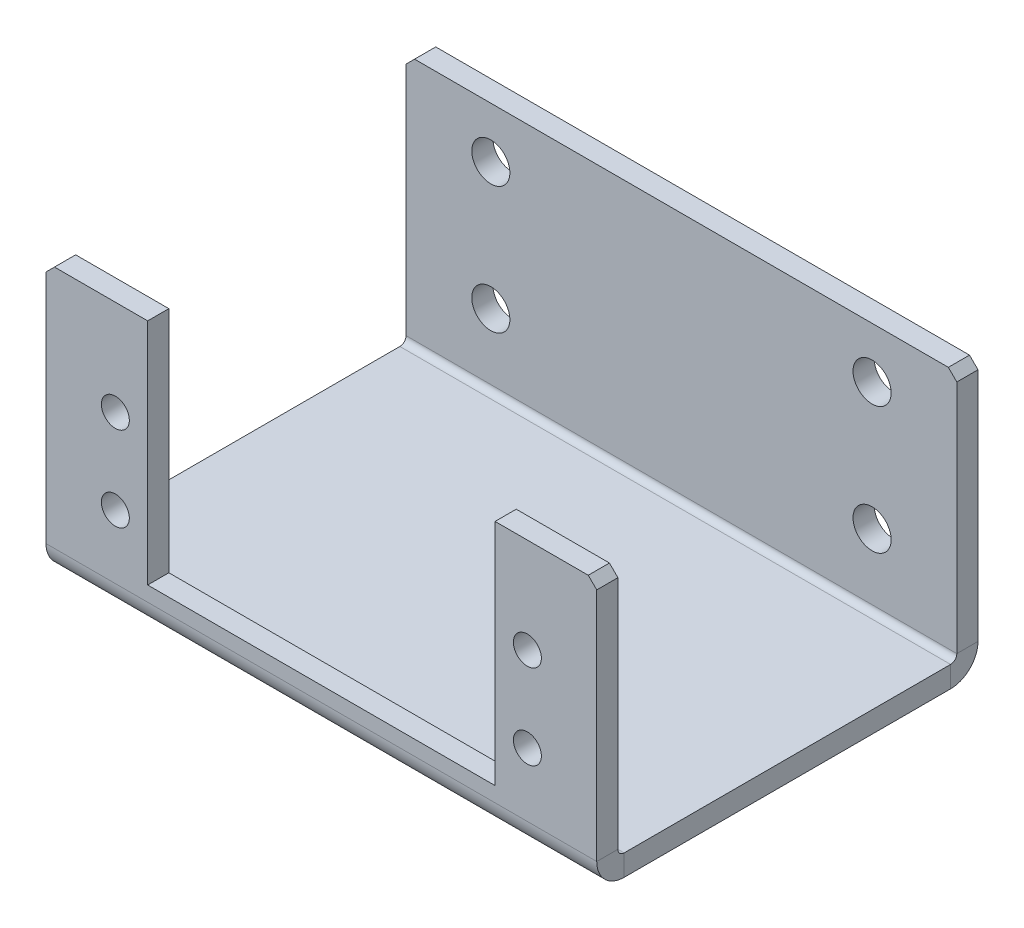
ISO-10303-21;
HEADER;
FILE_DESCRIPTION(('STEP AP214'),'2;1');
FILE_NAME('part.step','',(''),(''),'','','');
FILE_SCHEMA(('AUTOMOTIVE_DESIGN { 1 0 10303 214 1 1 1 1 }'));
ENDSEC;
DATA;
#1=APPLICATION_CONTEXT('core data for automotive mechanical design processes');
#2=APPLICATION_PROTOCOL_DEFINITION('international standard','automotive_design',2000,#1);
#3=PRODUCT_CONTEXT('',#1,'mechanical');
#4=PRODUCT('Part','Part','',(#3));
#5=PRODUCT_RELATED_PRODUCT_CATEGORY('part','',(#4));
#6=PRODUCT_DEFINITION_FORMATION('','',#4);
#7=PRODUCT_DEFINITION_CONTEXT('part definition',#1,'design');
#8=PRODUCT_DEFINITION('design','',#6,#7);
#9=PRODUCT_DEFINITION_SHAPE('','',#8);
#10=(LENGTH_UNIT() NAMED_UNIT(*) SI_UNIT(.MILLI.,.METRE.));
#11=(NAMED_UNIT(*) PLANE_ANGLE_UNIT() SI_UNIT($,.RADIAN.));
#12=(NAMED_UNIT(*) SI_UNIT($,.STERADIAN.) SOLID_ANGLE_UNIT());
#13=UNCERTAINTY_MEASURE_WITH_UNIT(LENGTH_MEASURE(1.E-05),#10,'distance_accuracy_value','');
#14=(GEOMETRIC_REPRESENTATION_CONTEXT(3) GLOBAL_UNCERTAINTY_ASSIGNED_CONTEXT((#13)) GLOBAL_UNIT_ASSIGNED_CONTEXT((#10,
#11,#12)) REPRESENTATION_CONTEXT('',''));
#15=CARTESIAN_POINT('',(0.,0.,0.));
#16=DIRECTION('',(0.,0.,1.));
#17=DIRECTION('',(1.,0.,0.));
#18=AXIS2_PLACEMENT_3D('',#15,#16,#17);
#19=CARTESIAN_POINT('',(-32.5,3.2366,20.));
#20=DIRECTION('',(-1.,0.,0.));
#21=DIRECTION('',(0.,0.,1.));
#22=AXIS2_PLACEMENT_3D('',#19,#20,#21);
#23=PLANE('',#22);
#24=DIRECTION('',(0.,0.,1.));
#25=VECTOR('',#24,1.);
#26=CARTESIAN_POINT('',(-32.5,0.,22.5));
#27=LINE('',#26,#25);
#28=CARTESIAN_POINT('',(-32.5,0.,-19.2634));
#29=VERTEX_POINT('',#28);
#30=CARTESIAN_POINT('',(-32.5,0.,19.2634));
#31=VERTEX_POINT('',#30);
#32=EDGE_CURVE('E247',#29,#31,#27,.T.);
#33=ORIENTED_EDGE('',*,*,#32,.T.);
#34=DIRECTION('',(0.,1.,0.));
#35=VECTOR('',#34,1.);
#36=CARTESIAN_POINT('',(-32.5,0.,19.2634));
#37=LINE('',#36,#35);
#38=CARTESIAN_POINT('',(-32.5,2.5,19.2634));
#39=VERTEX_POINT('',#38);
#40=EDGE_CURVE('E343',#31,#39,#37,.T.);
#41=ORIENTED_EDGE('',*,*,#40,.T.);
#42=DIRECTION('',(0.,0.,-1.));
#43=VECTOR('',#42,1.);
#44=CARTESIAN_POINT('',(-32.5,2.5,22.5));
#45=LINE('',#44,#43);
#46=CARTESIAN_POINT('',(-32.5,2.5,-19.2634));
#47=VERTEX_POINT('',#46);
#48=EDGE_CURVE('E328',#47,#39,#45,.F.);
#49=ORIENTED_EDGE('',*,*,#48,.F.);
#50=DIRECTION('',(0.,-1.,0.));
#51=VECTOR('',#50,1.);
#52=CARTESIAN_POINT('',(-32.5,2.5,-19.2634));
#53=LINE('',#52,#51);
#54=EDGE_CURVE('E207',#47,#29,#53,.T.);
#55=ORIENTED_EDGE('',*,*,#54,.T.);
#56=EDGE_LOOP('',(#33,#41,#49,#55));
#57=FACE_BOUND('',#56,.T.);
#58=ADVANCED_FACE('F39',(#57),#23,.T.);
#59=CARTESIAN_POINT('',(32.5,3.2366,-20.));
#60=DIRECTION('',(1.,0.,0.));
#61=DIRECTION('',(0.,0.,-1.));
#62=AXIS2_PLACEMENT_3D('',#59,#60,#61);
#63=PLANE('',#62);
#64=DIRECTION('',(0.,0.,1.));
#65=VECTOR('',#64,1.);
#66=CARTESIAN_POINT('',(32.5,0.,22.5));
#67=LINE('',#66,#65);
#68=CARTESIAN_POINT('',(32.5,0.,-19.2634));
#69=VERTEX_POINT('',#68);
#70=CARTESIAN_POINT('',(32.5,0.,19.2634));
#71=VERTEX_POINT('',#70);
#72=EDGE_CURVE('E324',#69,#71,#67,.T.);
#73=ORIENTED_EDGE('',*,*,#72,.F.);
#74=DIRECTION('',(0.,1.,0.));
#75=VECTOR('',#74,1.);
#76=CARTESIAN_POINT('',(32.5,0.,-19.2634));
#77=LINE('',#76,#75);
#78=CARTESIAN_POINT('',(32.5,2.5,-19.2634));
#79=VERTEX_POINT('',#78);
#80=EDGE_CURVE('E352',#69,#79,#77,.T.);
#81=ORIENTED_EDGE('',*,*,#80,.T.);
#82=DIRECTION('',(0.,0.,-1.));
#83=VECTOR('',#82,1.);
#84=CARTESIAN_POINT('',(32.5,2.5,22.5));
#85=LINE('',#84,#83);
#86=CARTESIAN_POINT('',(32.5,2.5,19.2634));
#87=VERTEX_POINT('',#86);
#88=EDGE_CURVE('E327',#79,#87,#85,.F.);
#89=ORIENTED_EDGE('',*,*,#88,.T.);
#90=DIRECTION('',(0.,-1.,0.));
#91=VECTOR('',#90,1.);
#92=CARTESIAN_POINT('',(32.5,2.5,19.2634));
#93=LINE('',#92,#91);
#94=EDGE_CURVE('E338',#87,#71,#93,.T.);
#95=ORIENTED_EDGE('',*,*,#94,.T.);
#96=EDGE_LOOP('',(#73,#81,#89,#95));
#97=FACE_BOUND('',#96,.T.);
#98=ADVANCED_FACE('F451',(#97),#63,.T.);
#99=CARTESIAN_POINT('',(32.5,0.,22.5));
#100=DIRECTION('',(0.,-1.,0.));
#101=DIRECTION('',(0.,0.,-1.));
#102=AXIS2_PLACEMENT_3D('',#99,#100,#101);
#103=PLANE('',#102);
#104=ORIENTED_EDGE('',*,*,#32,.F.);
#105=DIRECTION('',(-1.,0.,0.));
#106=VECTOR('',#105,1.);
#107=CARTESIAN_POINT('',(32.5,0.,-19.2634));
#108=LINE('',#107,#106);
#109=EDGE_CURVE('E346',#69,#29,#108,.T.);
#110=ORIENTED_EDGE('',*,*,#109,.F.);
#111=ORIENTED_EDGE('',*,*,#72,.T.);
#112=DIRECTION('',(-1.,0.,0.));
#113=VECTOR('',#112,1.);
#114=CARTESIAN_POINT('',(32.5,0.,19.2634));
#115=LINE('',#114,#113);
#116=EDGE_CURVE('E331',#71,#31,#115,.T.);
#117=ORIENTED_EDGE('',*,*,#116,.T.);
#118=EDGE_LOOP('',(#104,#110,#111,#117));
#119=FACE_BOUND('',#118,.T.);
#120=ADVANCED_FACE('F409',(#119),#103,.T.);
#121=CARTESIAN_POINT('',(32.5,2.5,22.5));
#122=DIRECTION('',(0.,-1.,0.));
#123=DIRECTION('',(0.,0.,-1.));
#124=AXIS2_PLACEMENT_3D('',#121,#122,#123);
#125=PLANE('',#124);
#126=ORIENTED_EDGE('',*,*,#48,.T.);
#127=DIRECTION('',(-1.,0.,0.));
#128=VECTOR('',#127,1.);
#129=CARTESIAN_POINT('',(32.5,2.5,19.2634));
#130=LINE('',#129,#128);
#131=EDGE_CURVE('E341',#87,#39,#130,.T.);
#132=ORIENTED_EDGE('',*,*,#131,.F.);
#133=ORIENTED_EDGE('',*,*,#88,.F.);
#134=DIRECTION('',(-1.,0.,0.));
#135=VECTOR('',#134,1.);
#136=CARTESIAN_POINT('',(32.5,2.5,-19.2634));
#137=LINE('',#136,#135);
#138=EDGE_CURVE('E349',#79,#47,#137,.T.);
#139=ORIENTED_EDGE('',*,*,#138,.T.);
#140=EDGE_LOOP('',(#126,#132,#133,#139));
#141=FACE_BOUND('',#140,.T.);
#142=ADVANCED_FACE('F403',(#141),#125,.F.);
#143=CARTESIAN_POINT('',(24.315,10.75,22.5));
#144=DIRECTION('',(0.,0.,1.));
#145=DIRECTION('',(1.,0.,0.));
#146=AXIS2_PLACEMENT_3D('',#143,#144,#145);
#147=CYLINDRICAL_SURFACE('',#146,1.64999999999999);
#148=CARTESIAN_POINT('',(24.315,10.75,22.5));
#149=DIRECTION('',(0.,0.,1.));
#150=DIRECTION('',(1.,0.,0.));
#151=AXIS2_PLACEMENT_3D('',#148,#149,#150);
#152=CIRCLE('',#151,1.64999999999999);
#153=CARTESIAN_POINT('',(25.965,10.75,22.5));
#154=VERTEX_POINT('',#153);
#155=EDGE_CURVE('E320',#154,#154,#152,.T.);
#156=ORIENTED_EDGE('',*,*,#155,.T.);
#157=EDGE_LOOP('',(#156));
#158=FACE_BOUND('',#157,.T.);
#159=CARTESIAN_POINT('',(24.315,10.75,20.));
#160=DIRECTION('',(0.,0.,1.));
#161=DIRECTION('',(1.,0.,0.));
#162=AXIS2_PLACEMENT_3D('',#159,#160,#161);
#163=CIRCLE('',#162,1.64999999999999);
#164=CARTESIAN_POINT('',(25.965,10.75,20.));
#165=VERTEX_POINT('',#164);
#166=EDGE_CURVE('E257',#165,#165,#163,.T.);
#167=ORIENTED_EDGE('',*,*,#166,.F.);
#168=EDGE_LOOP('',(#167));
#169=FACE_BOUND('',#168,.T.);
#170=ADVANCED_FACE('F757',(#158,#169),#147,.F.);
#171=CARTESIAN_POINT('',(24.315,20.75,22.5));
#172=DIRECTION('',(0.,0.,1.));
#173=DIRECTION('',(1.,0.,0.));
#174=AXIS2_PLACEMENT_3D('',#171,#172,#173);
#175=CYLINDRICAL_SURFACE('',#174,1.64999999999999);
#176=CARTESIAN_POINT('',(24.315,20.75,22.5));
#177=DIRECTION('',(0.,0.,1.));
#178=DIRECTION('',(1.,0.,0.));
#179=AXIS2_PLACEMENT_3D('',#176,#177,#178);
#180=CIRCLE('',#179,1.64999999999999);
#181=CARTESIAN_POINT('',(25.965,20.75,22.5));
#182=VERTEX_POINT('',#181);
#183=EDGE_CURVE('E317',#182,#182,#180,.T.);
#184=ORIENTED_EDGE('',*,*,#183,.T.);
#185=EDGE_LOOP('',(#184));
#186=FACE_BOUND('',#185,.T.);
#187=CARTESIAN_POINT('',(24.315,20.75,20.));
#188=DIRECTION('',(0.,0.,1.));
#189=DIRECTION('',(1.,0.,0.));
#190=AXIS2_PLACEMENT_3D('',#187,#188,#189);
#191=CIRCLE('',#190,1.64999999999999);
#192=CARTESIAN_POINT('',(25.965,20.75,20.));
#193=VERTEX_POINT('',#192);
#194=EDGE_CURVE('E260',#193,#193,#191,.T.);
#195=ORIENTED_EDGE('',*,*,#194,.F.);
#196=EDGE_LOOP('',(#195));
#197=FACE_BOUND('',#196,.T.);
#198=ADVANCED_FACE('F746',(#186,#197),#175,.F.);
#199=CARTESIAN_POINT('',(-24.315,10.75,22.5));
#200=DIRECTION('',(0.,0.,1.));
#201=DIRECTION('',(1.,0.,0.));
#202=AXIS2_PLACEMENT_3D('',#199,#200,#201);
#203=CYLINDRICAL_SURFACE('',#202,1.64999999999999);
#204=CARTESIAN_POINT('',(-24.315,10.75,22.5));
#205=DIRECTION('',(0.,0.,1.));
#206=DIRECTION('',(1.,0.,0.));
#207=AXIS2_PLACEMENT_3D('',#204,#205,#206);
#208=CIRCLE('',#207,1.64999999999999);
#209=CARTESIAN_POINT('',(-22.665,10.75,22.5));
#210=VERTEX_POINT('',#209);
#211=EDGE_CURVE('E314',#210,#210,#208,.T.);
#212=ORIENTED_EDGE('',*,*,#211,.T.);
#213=EDGE_LOOP('',(#212));
#214=FACE_BOUND('',#213,.T.);
#215=CARTESIAN_POINT('',(-24.315,10.75,20.));
#216=DIRECTION('',(0.,0.,1.));
#217=DIRECTION('',(1.,0.,0.));
#218=AXIS2_PLACEMENT_3D('',#215,#216,#217);
#219=CIRCLE('',#218,1.64999999999999);
#220=CARTESIAN_POINT('',(-22.665,10.75,20.));
#221=VERTEX_POINT('',#220);
#222=EDGE_CURVE('E263',#221,#221,#219,.T.);
#223=ORIENTED_EDGE('',*,*,#222,.F.);
#224=EDGE_LOOP('',(#223));
#225=FACE_BOUND('',#224,.T.);
#226=ADVANCED_FACE('F735',(#214,#225),#203,.F.);
#227=CARTESIAN_POINT('',(-24.315,20.75,22.5));
#228=DIRECTION('',(0.,0.,1.));
#229=DIRECTION('',(1.,0.,0.));
#230=AXIS2_PLACEMENT_3D('',#227,#228,#229);
#231=CYLINDRICAL_SURFACE('',#230,1.64999999999999);
#232=CARTESIAN_POINT('',(-24.315,20.75,22.5));
#233=DIRECTION('',(0.,0.,1.));
#234=DIRECTION('',(1.,0.,0.));
#235=AXIS2_PLACEMENT_3D('',#232,#233,#234);
#236=CIRCLE('',#235,1.64999999999999);
#237=CARTESIAN_POINT('',(-22.665,20.75,22.5));
#238=VERTEX_POINT('',#237);
#239=EDGE_CURVE('E309',#238,#238,#236,.T.);
#240=ORIENTED_EDGE('',*,*,#239,.T.);
#241=EDGE_LOOP('',(#240));
#242=FACE_BOUND('',#241,.T.);
#243=CARTESIAN_POINT('',(-24.315,20.75,20.));
#244=DIRECTION('',(0.,0.,1.));
#245=DIRECTION('',(1.,0.,0.));
#246=AXIS2_PLACEMENT_3D('',#243,#244,#245);
#247=CIRCLE('',#246,1.64999999999999);
#248=CARTESIAN_POINT('',(-22.665,20.75,20.));
#249=VERTEX_POINT('',#248);
#250=EDGE_CURVE('E266',#249,#249,#247,.T.);
#251=ORIENTED_EDGE('',*,*,#250,.F.);
#252=EDGE_LOOP('',(#251));
#253=FACE_BOUND('',#252,.T.);
#254=ADVANCED_FACE('F609',(#242,#253),#231,.F.);
#255=CARTESIAN_POINT('',(32.5,32.,22.5));
#256=DIRECTION('',(0.,1.,0.));
#257=DIRECTION('',(0.,0.,1.));
#258=AXIS2_PLACEMENT_3D('',#255,#256,#257);
#259=PLANE('',#258);
#260=DIRECTION('',(-1.,0.,0.));
#261=VECTOR('',#260,1.);
#262=CARTESIAN_POINT('',(32.5,32.,22.5));
#263=LINE('',#262,#261);
#264=CARTESIAN_POINT('',(31.5,32.,22.5));
#265=VERTEX_POINT('',#264);
#266=CARTESIAN_POINT('',(20.5,32.,22.5));
#267=VERTEX_POINT('',#266);
#268=EDGE_CURVE('E275',#265,#267,#263,.T.);
#269=ORIENTED_EDGE('',*,*,#268,.F.);
#270=DIRECTION('',(0.,0.,-1.));
#271=VECTOR('',#270,1.);
#272=CARTESIAN_POINT('',(31.5,32.,22.5));
#273=LINE('',#272,#271);
#274=CARTESIAN_POINT('',(31.5,32.,20.));
#275=VERTEX_POINT('',#274);
#276=EDGE_CURVE('E371',#265,#275,#273,.T.);
#277=ORIENTED_EDGE('',*,*,#276,.T.);
#278=DIRECTION('',(-1.,0.,0.));
#279=VECTOR('',#278,1.);
#280=CARTESIAN_POINT('',(32.5,32.,20.));
#281=LINE('',#280,#279);
#282=CARTESIAN_POINT('',(20.5,32.,20.));
#283=VERTEX_POINT('',#282);
#284=EDGE_CURVE('E306',#275,#283,#281,.T.);
#285=ORIENTED_EDGE('',*,*,#284,.T.);
#286=DIRECTION('',(0.,0.,-1.));
#287=VECTOR('',#286,1.);
#288=CARTESIAN_POINT('',(20.5,32.,22.5010000000002));
#289=LINE('',#288,#287);
#290=EDGE_CURVE('E292',#267,#283,#289,.T.);
#291=ORIENTED_EDGE('',*,*,#290,.F.);
#292=EDGE_LOOP('',(#269,#277,#285,#291));
#293=FACE_BOUND('',#292,.T.);
#294=ADVANCED_FACE('F429',(#293),#259,.T.);
#295=CARTESIAN_POINT('',(-20.5,32.,20.));
#296=VERTEX_POINT('',#295);
#297=CARTESIAN_POINT('',(-31.5,32.,20.));
#298=VERTEX_POINT('',#297);
#299=EDGE_CURVE('E305',#296,#298,#281,.T.);
#300=ORIENTED_EDGE('',*,*,#299,.T.);
#301=DIRECTION('',(0.,0.,1.));
#302=VECTOR('',#301,1.);
#303=CARTESIAN_POINT('',(-31.5,32.,22.5));
#304=LINE('',#303,#302);
#305=CARTESIAN_POINT('',(-31.5,32.,22.5));
#306=VERTEX_POINT('',#305);
#307=EDGE_CURVE('E11',#298,#306,#304,.T.);
#308=ORIENTED_EDGE('',*,*,#307,.T.);
#309=CARTESIAN_POINT('',(-20.5,32.,22.5));
#310=VERTEX_POINT('',#309);
#311=EDGE_CURVE('E278',#310,#306,#263,.T.);
#312=ORIENTED_EDGE('',*,*,#311,.F.);
#313=DIRECTION('',(0.,0.,-1.));
#314=VECTOR('',#313,1.);
#315=CARTESIAN_POINT('',(-20.5,32.,22.5010000000002));
#316=LINE('',#315,#314);
#317=EDGE_CURVE('E308',#310,#296,#316,.T.);
#318=ORIENTED_EDGE('',*,*,#317,.T.);
#319=EDGE_LOOP('',(#300,#308,#312,#318));
#320=FACE_BOUND('',#319,.T.);
#321=ADVANCED_FACE('F440',(#320),#259,.T.);
#322=CARTESIAN_POINT('',(-20.5,5.,22.5010000000002));
#323=DIRECTION('',(-1.,0.,0.));
#324=DIRECTION('',(0.,0.,1.));
#325=AXIS2_PLACEMENT_3D('',#322,#323,#324);
#326=PLANE('',#325);
#327=DIRECTION('',(0.,0.,-1.));
#328=VECTOR('',#327,1.);
#329=CARTESIAN_POINT('',(-20.5,5.,22.5010000000002));
#330=LINE('',#329,#328);
#331=CARTESIAN_POINT('',(-20.5,5.,22.5));
#332=VERTEX_POINT('',#331);
#333=CARTESIAN_POINT('',(-20.5,5.,20.));
#334=VERTEX_POINT('',#333);
#335=EDGE_CURVE('E303',#332,#334,#330,.T.);
#336=ORIENTED_EDGE('',*,*,#335,.T.);
#337=DIRECTION('',(0.,1.,0.));
#338=VECTOR('',#337,1.);
#339=CARTESIAN_POINT('',(-20.5,5.,20.));
#340=LINE('',#339,#338);
#341=EDGE_CURVE('E301',#334,#296,#340,.T.);
#342=ORIENTED_EDGE('',*,*,#341,.T.);
#343=ORIENTED_EDGE('',*,*,#317,.F.);
#344=DIRECTION('',(0.,1.,0.));
#345=VECTOR('',#344,1.);
#346=CARTESIAN_POINT('',(-20.5,5.,22.5));
#347=LINE('',#346,#345);
#348=EDGE_CURVE('E281',#332,#310,#347,.T.);
#349=ORIENTED_EDGE('',*,*,#348,.F.);
#350=EDGE_LOOP('',(#336,#342,#343,#349));
#351=FACE_BOUND('',#350,.T.);
#352=ADVANCED_FACE('F441',(#351),#326,.F.);
#353=CARTESIAN_POINT('',(-20.5,5.,22.5010000000002));
#354=DIRECTION('',(0.,-1.,0.));
#355=DIRECTION('',(1.,0.,0.));
#356=AXIS2_PLACEMENT_3D('',#353,#354,#355);
#357=PLANE('',#356);
#358=DIRECTION('',(0.,0.,-1.));
#359=VECTOR('',#358,1.);
#360=CARTESIAN_POINT('',(20.5,5.,22.5010000000002));
#361=LINE('',#360,#359);
#362=CARTESIAN_POINT('',(20.5,5.,22.5));
#363=VERTEX_POINT('',#362);
#364=CARTESIAN_POINT('',(20.5,5.,20.));
#365=VERTEX_POINT('',#364);
#366=EDGE_CURVE('E298',#363,#365,#361,.T.);
#367=ORIENTED_EDGE('',*,*,#366,.T.);
#368=DIRECTION('',(-1.,0.,0.));
#369=VECTOR('',#368,1.);
#370=CARTESIAN_POINT('',(-20.5,5.,20.));
#371=LINE('',#370,#369);
#372=EDGE_CURVE('E295',#365,#334,#371,.T.);
#373=ORIENTED_EDGE('',*,*,#372,.T.);
#374=ORIENTED_EDGE('',*,*,#335,.F.);
#375=DIRECTION('',(-1.,0.,0.));
#376=VECTOR('',#375,1.);
#377=CARTESIAN_POINT('',(-20.5,5.,22.5));
#378=LINE('',#377,#376);
#379=EDGE_CURVE('E284',#363,#332,#378,.T.);
#380=ORIENTED_EDGE('',*,*,#379,.F.);
#381=EDGE_LOOP('',(#367,#373,#374,#380));
#382=FACE_BOUND('',#381,.T.);
#383=ADVANCED_FACE('F438',(#382),#357,.F.);
#384=CARTESIAN_POINT('',(20.5,5.,22.5010000000002));
#385=DIRECTION('',(1.,0.,0.));
#386=DIRECTION('',(0.,0.,-1.));
#387=AXIS2_PLACEMENT_3D('',#384,#385,#386);
#388=PLANE('',#387);
#389=ORIENTED_EDGE('',*,*,#290,.T.);
#390=DIRECTION('',(0.,-1.,0.));
#391=VECTOR('',#390,1.);
#392=CARTESIAN_POINT('',(20.5,5.,20.));
#393=LINE('',#392,#391);
#394=EDGE_CURVE('E290',#283,#365,#393,.T.);
#395=ORIENTED_EDGE('',*,*,#394,.T.);
#396=ORIENTED_EDGE('',*,*,#366,.F.);
#397=DIRECTION('',(0.,-1.,0.));
#398=VECTOR('',#397,1.);
#399=CARTESIAN_POINT('',(20.5,5.,22.5));
#400=LINE('',#399,#398);
#401=EDGE_CURVE('E287',#267,#363,#400,.T.);
#402=ORIENTED_EDGE('',*,*,#401,.F.);
#403=EDGE_LOOP('',(#389,#395,#396,#402));
#404=FACE_BOUND('',#403,.T.);
#405=ADVANCED_FACE('F432',(#404),#388,.F.);
#406=CARTESIAN_POINT('',(32.5,0.,22.5));
#407=DIRECTION('',(0.,0.,1.));
#408=DIRECTION('',(1.,0.,0.));
#409=AXIS2_PLACEMENT_3D('',#406,#407,#408);
#410=PLANE('',#409);
#411=DIRECTION('',(0.,1.,0.));
#412=VECTOR('',#411,1.);
#413=CARTESIAN_POINT('',(32.5,0.,22.5));
#414=LINE('',#413,#412);
#415=CARTESIAN_POINT('',(32.5,3.2366,22.5));
#416=VERTEX_POINT('',#415);
#417=CARTESIAN_POINT('',(32.5,31.,22.5));
#418=VERTEX_POINT('',#417);
#419=EDGE_CURVE('E277',#416,#418,#414,.T.);
#420=ORIENTED_EDGE('',*,*,#419,.T.);
#421=DIRECTION('',(0.707106781186545,-0.70710678118655,0.));
#422=VECTOR('',#421,1.);
#423=CARTESIAN_POINT('',(48.,15.4999999999999,22.5));
#424=LINE('',#423,#422);
#425=EDGE_CURVE('E381',#418,#265,#424,.F.);
#426=ORIENTED_EDGE('',*,*,#425,.T.);
#427=ORIENTED_EDGE('',*,*,#268,.T.);
#428=ORIENTED_EDGE('',*,*,#401,.T.);
#429=ORIENTED_EDGE('',*,*,#379,.T.);
#430=ORIENTED_EDGE('',*,*,#348,.T.);
#431=ORIENTED_EDGE('',*,*,#311,.T.);
#432=DIRECTION('',(0.707106781186548,0.707106781186548,0.));
#433=VECTOR('',#432,1.);
#434=CARTESIAN_POINT('',(-15.5,48.,22.5));
#435=LINE('',#434,#433);
#436=CARTESIAN_POINT('',(-32.5,31.,22.5));
#437=VERTEX_POINT('',#436);
#438=EDGE_CURVE('E54',#306,#437,#435,.F.);
#439=ORIENTED_EDGE('',*,*,#438,.T.);
#440=DIRECTION('',(0.,1.,0.));
#441=VECTOR('',#440,1.);
#442=CARTESIAN_POINT('',(-32.5,0.,22.5));
#443=LINE('',#442,#441);
#444=CARTESIAN_POINT('',(-32.5,3.2366,22.5));
#445=VERTEX_POINT('',#444);
#446=EDGE_CURVE('E245',#445,#437,#443,.T.);
#447=ORIENTED_EDGE('',*,*,#446,.F.);
#448=DIRECTION('',(-1.,0.,0.));
#449=VECTOR('',#448,1.);
#450=CARTESIAN_POINT('',(32.5,3.2366,22.5));
#451=LINE('',#450,#449);
#452=EDGE_CURVE('E241',#416,#445,#451,.T.);
#453=ORIENTED_EDGE('',*,*,#452,.F.);
#454=EDGE_LOOP('',(#420,#426,#427,#428,#429,#430,#431,#439,#447,#453));
#455=FACE_BOUND('',#454,.T.);
#456=ORIENTED_EDGE('',*,*,#239,.F.);
#457=EDGE_LOOP('',(#456));
#458=FACE_BOUND('',#457,.T.);
#459=ORIENTED_EDGE('',*,*,#211,.F.);
#460=EDGE_LOOP('',(#459));
#461=FACE_BOUND('',#460,.T.);
#462=ORIENTED_EDGE('',*,*,#183,.F.);
#463=EDGE_LOOP('',(#462));
#464=FACE_BOUND('',#463,.T.);
#465=ORIENTED_EDGE('',*,*,#155,.F.);
#466=EDGE_LOOP('',(#465));
#467=FACE_BOUND('',#466,.T.);
#468=ADVANCED_FACE('F415',(#455,#458,#461,#464,#467),#410,.T.);
#469=CARTESIAN_POINT('',(32.5,2.5,19.2634));
#470=DIRECTION('',(1.,0.,0.));
#471=DIRECTION('',(0.,0.,-1.));
#472=AXIS2_PLACEMENT_3D('',#469,#470,#471);
#473=PLANE('',#472);
#474=DIRECTION('',(0.,1.,0.));
#475=VECTOR('',#474,1.);
#476=CARTESIAN_POINT('',(32.5,0.,20.));
#477=LINE('',#476,#475);
#478=CARTESIAN_POINT('',(32.5,3.2366,20.));
#479=VERTEX_POINT('',#478);
#480=CARTESIAN_POINT('',(32.5,31.,20.));
#481=VERTEX_POINT('',#480);
#482=EDGE_CURVE('E269',#479,#481,#477,.T.);
#483=ORIENTED_EDGE('',*,*,#482,.T.);
#484=DIRECTION('',(0.,0.,1.));
#485=VECTOR('',#484,1.);
#486=CARTESIAN_POINT('',(32.5,31.,19.2634));
#487=LINE('',#486,#485);
#488=EDGE_CURVE('E378',#481,#418,#487,.T.);
#489=ORIENTED_EDGE('',*,*,#488,.T.);
#490=ORIENTED_EDGE('',*,*,#419,.F.);
#491=DIRECTION('',(0.,0.,-1.));
#492=VECTOR('',#491,1.);
#493=CARTESIAN_POINT('',(32.5,3.2366,22.5));
#494=LINE('',#493,#492);
#495=EDGE_CURVE('E272',#416,#479,#494,.T.);
#496=ORIENTED_EDGE('',*,*,#495,.T.);
#497=EDGE_LOOP('',(#483,#489,#490,#496));
#498=FACE_BOUND('',#497,.T.);
#499=ADVANCED_FACE('F420',(#498),#473,.T.);
#500=CARTESIAN_POINT('',(32.5,0.,20.));
#501=DIRECTION('',(0.,0.,1.));
#502=DIRECTION('',(1.,0.,0.));
#503=AXIS2_PLACEMENT_3D('',#500,#501,#502);
#504=PLANE('',#503);
#505=ORIENTED_EDGE('',*,*,#250,.T.);
#506=EDGE_LOOP('',(#505));
#507=FACE_BOUND('',#506,.T.);
#508=ORIENTED_EDGE('',*,*,#222,.T.);
#509=EDGE_LOOP('',(#508));
#510=FACE_BOUND('',#509,.T.);
#511=ORIENTED_EDGE('',*,*,#194,.T.);
#512=EDGE_LOOP('',(#511));
#513=FACE_BOUND('',#512,.T.);
#514=ORIENTED_EDGE('',*,*,#166,.T.);
#515=EDGE_LOOP('',(#514));
#516=FACE_BOUND('',#515,.T.);
#517=ORIENTED_EDGE('',*,*,#284,.F.);
#518=DIRECTION('',(-0.707106781186545,0.70710678118655,0.));
#519=VECTOR('',#518,1.);
#520=CARTESIAN_POINT('',(31.5,32.,20.));
#521=LINE('',#520,#519);
#522=EDGE_CURVE('E376',#275,#481,#521,.F.);
#523=ORIENTED_EDGE('',*,*,#522,.T.);
#524=ORIENTED_EDGE('',*,*,#482,.F.);
#525=DIRECTION('',(-1.,0.,0.));
#526=VECTOR('',#525,1.);
#527=CARTESIAN_POINT('',(32.5,3.2366,20.));
#528=LINE('',#527,#526);
#529=CARTESIAN_POINT('',(-32.5,3.2366,20.));
#530=VERTEX_POINT('',#529);
#531=EDGE_CURVE('E254',#479,#530,#528,.T.);
#532=ORIENTED_EDGE('',*,*,#531,.T.);
#533=DIRECTION('',(0.,1.,0.));
#534=VECTOR('',#533,1.);
#535=CARTESIAN_POINT('',(-32.5,0.,20.));
#536=LINE('',#535,#534);
#537=CARTESIAN_POINT('',(-32.5,31.,20.));
#538=VERTEX_POINT('',#537);
#539=EDGE_CURVE('E251',#530,#538,#536,.T.);
#540=ORIENTED_EDGE('',*,*,#539,.T.);
#541=DIRECTION('',(-0.707106781186548,-0.707106781186548,0.));
#542=VECTOR('',#541,1.);
#543=CARTESIAN_POINT('',(-32.5,31.,20.));
#544=LINE('',#543,#542);
#545=EDGE_CURVE('E374',#538,#298,#544,.F.);
#546=ORIENTED_EDGE('',*,*,#545,.T.);
#547=ORIENTED_EDGE('',*,*,#299,.F.);
#548=ORIENTED_EDGE('',*,*,#341,.F.);
#549=ORIENTED_EDGE('',*,*,#372,.F.);
#550=ORIENTED_EDGE('',*,*,#394,.F.);
#551=EDGE_LOOP('',(#517,#523,#524,#532,#540,#546,#547,#548,#549,#550));
#552=FACE_BOUND('',#551,.T.);
#553=ADVANCED_FACE('F390',(#507,#510,#513,#516,#552),#504,.F.);
#554=CARTESIAN_POINT('',(-32.5,3.2366,19.2634));
#555=DIRECTION('',(-1.,0.,0.));
#556=DIRECTION('',(0.,0.,1.));
#557=AXIS2_PLACEMENT_3D('',#554,#555,#556);
#558=PLANE('',#557);
#559=ORIENTED_EDGE('',*,*,#446,.T.);
#560=DIRECTION('',(0.,0.,-1.));
#561=VECTOR('',#560,1.);
#562=CARTESIAN_POINT('',(-32.5,31.,19.2634));
#563=LINE('',#562,#561);
#564=EDGE_CURVE('E47',#437,#538,#563,.T.);
#565=ORIENTED_EDGE('',*,*,#564,.T.);
#566=ORIENTED_EDGE('',*,*,#539,.F.);
#567=DIRECTION('',(0.,0.,1.));
#568=VECTOR('',#567,1.);
#569=CARTESIAN_POINT('',(-32.5,3.2366,20.));
#570=LINE('',#569,#568);
#571=EDGE_CURVE('E248',#530,#445,#570,.T.);
#572=ORIENTED_EDGE('',*,*,#571,.T.);
#573=EDGE_LOOP('',(#559,#565,#566,#572));
#574=FACE_BOUND('',#573,.T.);
#575=ADVANCED_FACE('F386',(#574),#558,.T.);
#576=CARTESIAN_POINT('',(32.5,3.2366,19.2634));
#577=DIRECTION('',(1.,0.,0.));
#578=DIRECTION('',(0.,0.,-1.));
#579=AXIS2_PLACEMENT_3D('',#576,#577,#578);
#580=PLANE('',#579);
#581=ORIENTED_EDGE('',*,*,#94,.F.);
#582=CARTESIAN_POINT('',(32.5,3.2366,19.2634));
#583=DIRECTION('',(1.,0.,0.));
#584=DIRECTION('',(0.,0.,-1.));
#585=AXIS2_PLACEMENT_3D('',#582,#583,#584);
#586=CIRCLE('',#585,0.7366);
#587=EDGE_CURVE('E230',#87,#479,#586,.F.);
#588=ORIENTED_EDGE('',*,*,#587,.T.);
#589=ORIENTED_EDGE('',*,*,#495,.F.);
#590=CARTESIAN_POINT('',(32.5,3.2366,19.2634));
#591=DIRECTION('',(-1.,0.,0.));
#592=DIRECTION('',(0.,0.,1.));
#593=AXIS2_PLACEMENT_3D('',#590,#591,#592);
#594=CIRCLE('',#593,3.2366);
#595=EDGE_CURVE('E234',#71,#416,#594,.T.);
#596=ORIENTED_EDGE('',*,*,#595,.F.);
#597=EDGE_LOOP('',(#581,#588,#589,#596));
#598=FACE_BOUND('',#597,.T.);
#599=ADVANCED_FACE('F558',(#598),#580,.T.);
#600=CARTESIAN_POINT('',(-32.5,3.2366,19.2634));
#601=DIRECTION('',(-1.,0.,0.));
#602=DIRECTION('',(0.,0.,1.));
#603=AXIS2_PLACEMENT_3D('',#600,#601,#602);
#604=PLANE('',#603);
#605=ORIENTED_EDGE('',*,*,#571,.F.);
#606=CARTESIAN_POINT('',(-32.5,3.2366,19.2634));
#607=DIRECTION('',(1.,0.,0.));
#608=DIRECTION('',(0.,0.,-1.));
#609=AXIS2_PLACEMENT_3D('',#606,#607,#608);
#610=CIRCLE('',#609,0.7366);
#611=EDGE_CURVE('E238',#530,#39,#610,.T.);
#612=ORIENTED_EDGE('',*,*,#611,.T.);
#613=ORIENTED_EDGE('',*,*,#40,.F.);
#614=CARTESIAN_POINT('',(-32.5,3.2366,19.2634));
#615=DIRECTION('',(1.,0.,0.));
#616=DIRECTION('',(0.,0.,-1.));
#617=AXIS2_PLACEMENT_3D('',#614,#615,#616);
#618=CIRCLE('',#617,3.2366);
#619=EDGE_CURVE('E237',#445,#31,#618,.T.);
#620=ORIENTED_EDGE('',*,*,#619,.F.);
#621=EDGE_LOOP('',(#605,#612,#613,#620));
#622=FACE_BOUND('',#621,.T.);
#623=ADVANCED_FACE('F400',(#622),#604,.T.);
#624=CARTESIAN_POINT('',(-65.1228669113135,3.2366,19.2634));
#625=DIRECTION('',(1.,0.,0.));
#626=DIRECTION('',(0.,0.,-1.));
#627=AXIS2_PLACEMENT_3D('',#624,#625,#626);
#628=CYLINDRICAL_SURFACE('',#627,3.2366);
#629=ORIENTED_EDGE('',*,*,#619,.T.);
#630=ORIENTED_EDGE('',*,*,#116,.F.);
#631=ORIENTED_EDGE('',*,*,#595,.T.);
#632=ORIENTED_EDGE('',*,*,#452,.T.);
#633=EDGE_LOOP('',(#629,#630,#631,#632));
#634=FACE_BOUND('',#633,.T.);
#635=ADVANCED_FACE('F413',(#634),#628,.T.);
#636=CARTESIAN_POINT('',(-65.1228669113135,3.2366,19.2634));
#637=DIRECTION('',(1.,0.,0.));
#638=DIRECTION('',(0.,0.,-1.));
#639=AXIS2_PLACEMENT_3D('',#636,#637,#638);
#640=CYLINDRICAL_SURFACE('',#639,0.7366);
#641=ORIENTED_EDGE('',*,*,#611,.F.);
#642=ORIENTED_EDGE('',*,*,#531,.F.);
#643=ORIENTED_EDGE('',*,*,#587,.F.);
#644=ORIENTED_EDGE('',*,*,#131,.T.);
#645=EDGE_LOOP('',(#641,#642,#643,#644));
#646=FACE_BOUND('',#645,.T.);
#647=ADVANCED_FACE('F397',(#646),#640,.F.);
#648=CARTESIAN_POINT('',(32.5,3.2366,-19.2634));
#649=DIRECTION('',(1.,0.,0.));
#650=DIRECTION('',(0.,0.,-1.));
#651=AXIS2_PLACEMENT_3D('',#648,#649,#650);
#652=PLANE('',#651);
#653=DIRECTION('',(0.,0.,-1.));
#654=VECTOR('',#653,1.);
#655=CARTESIAN_POINT('',(32.5,3.23660000000003,-20.));
#656=LINE('',#655,#654);
#657=CARTESIAN_POINT('',(32.5,3.23660000000003,-20.));
#658=VERTEX_POINT('',#657);
#659=CARTESIAN_POINT('',(32.5,3.23660000000003,-22.5));
#660=VERTEX_POINT('',#659);
#661=EDGE_CURVE('E233',#658,#660,#656,.T.);
#662=ORIENTED_EDGE('',*,*,#661,.F.);
#663=CARTESIAN_POINT('',(32.5,3.2366,-19.2634));
#664=DIRECTION('',(1.,0.,0.));
#665=DIRECTION('',(0.,0.,-1.));
#666=AXIS2_PLACEMENT_3D('',#663,#664,#665);
#667=CIRCLE('',#666,0.7366);
#668=EDGE_CURVE('E212',#658,#79,#667,.F.);
#669=ORIENTED_EDGE('',*,*,#668,.T.);
#670=ORIENTED_EDGE('',*,*,#80,.F.);
#671=CARTESIAN_POINT('',(32.5,3.2366,-19.2634));
#672=DIRECTION('',(-1.,0.,0.));
#673=DIRECTION('',(0.,0.,1.));
#674=AXIS2_PLACEMENT_3D('',#671,#672,#673);
#675=CIRCLE('',#674,3.2366);
#676=EDGE_CURVE('E211',#660,#69,#675,.T.);
#677=ORIENTED_EDGE('',*,*,#676,.F.);
#678=EDGE_LOOP('',(#662,#669,#670,#677));
#679=FACE_BOUND('',#678,.T.);
#680=ADVANCED_FACE('F668',(#679),#652,.T.);
#681=CARTESIAN_POINT('',(-32.5,3.2366,-19.2634));
#682=DIRECTION('',(-1.,0.,0.));
#683=DIRECTION('',(0.,0.,1.));
#684=AXIS2_PLACEMENT_3D('',#681,#682,#683);
#685=PLANE('',#684);
#686=ORIENTED_EDGE('',*,*,#54,.F.);
#687=CARTESIAN_POINT('',(-32.5,3.2366,-19.2634));
#688=DIRECTION('',(1.,0.,0.));
#689=DIRECTION('',(0.,0.,-1.));
#690=AXIS2_PLACEMENT_3D('',#687,#688,#689);
#691=CIRCLE('',#690,0.7366);
#692=CARTESIAN_POINT('',(-32.5,3.23660000000003,-20.));
#693=VERTEX_POINT('',#692);
#694=EDGE_CURVE('E204',#47,#693,#691,.T.);
#695=ORIENTED_EDGE('',*,*,#694,.T.);
#696=DIRECTION('',(0.,0.,1.));
#697=VECTOR('',#696,1.);
#698=CARTESIAN_POINT('',(-32.5,3.23660000000004,-22.5));
#699=LINE('',#698,#697);
#700=CARTESIAN_POINT('',(-32.5,3.23660000000004,-22.5));
#701=VERTEX_POINT('',#700);
#702=EDGE_CURVE('E191',#701,#693,#699,.T.);
#703=ORIENTED_EDGE('',*,*,#702,.F.);
#704=CARTESIAN_POINT('',(-32.5,3.2366,-19.2634));
#705=DIRECTION('',(1.,0.,0.));
#706=DIRECTION('',(0.,0.,-1.));
#707=AXIS2_PLACEMENT_3D('',#704,#705,#706);
#708=CIRCLE('',#707,3.2366);
#709=EDGE_CURVE('E229',#29,#701,#708,.T.);
#710=ORIENTED_EDGE('',*,*,#709,.F.);
#711=EDGE_LOOP('',(#686,#695,#703,#710));
#712=FACE_BOUND('',#711,.T.);
#713=ADVANCED_FACE('F205',(#712),#685,.T.);
#714=CARTESIAN_POINT('',(-65.1228669113136,3.2366,-19.2634));
#715=DIRECTION('',(1.,0.,0.));
#716=DIRECTION('',(0.,0.,-1.));
#717=AXIS2_PLACEMENT_3D('',#714,#715,#716);
#718=CYLINDRICAL_SURFACE('',#717,3.2366);
#719=ORIENTED_EDGE('',*,*,#709,.T.);
#720=DIRECTION('',(-1.,0.,0.));
#721=VECTOR('',#720,1.);
#722=CARTESIAN_POINT('',(32.5,3.23660000000004,-22.5));
#723=LINE('',#722,#721);
#724=EDGE_CURVE('E866',#660,#701,#723,.T.);
#725=ORIENTED_EDGE('',*,*,#724,.F.);
#726=ORIENTED_EDGE('',*,*,#676,.T.);
#727=ORIENTED_EDGE('',*,*,#109,.T.);
#728=EDGE_LOOP('',(#719,#725,#726,#727));
#729=FACE_BOUND('',#728,.T.);
#730=ADVANCED_FACE('F651',(#729),#718,.T.);
#731=CARTESIAN_POINT('',(-65.1228669113136,3.2366,-19.2634));
#732=DIRECTION('',(1.,0.,0.));
#733=DIRECTION('',(0.,0.,-1.));
#734=AXIS2_PLACEMENT_3D('',#731,#732,#733);
#735=CYLINDRICAL_SURFACE('',#734,0.7366);
#736=ORIENTED_EDGE('',*,*,#694,.F.);
#737=ORIENTED_EDGE('',*,*,#138,.F.);
#738=ORIENTED_EDGE('',*,*,#668,.F.);
#739=DIRECTION('',(-1.,0.,0.));
#740=VECTOR('',#739,1.);
#741=CARTESIAN_POINT('',(32.5,3.23660000000003,-20.));
#742=LINE('',#741,#740);
#743=EDGE_CURVE('E183',#658,#693,#742,.T.);
#744=ORIENTED_EDGE('',*,*,#743,.T.);
#745=EDGE_LOOP('',(#736,#737,#738,#744));
#746=FACE_BOUND('',#745,.T.);
#747=ADVANCED_FACE('F215',(#746),#735,.F.);
#748=CARTESIAN_POINT('',(32.5,32.,-20.));
#749=DIRECTION('',(0.,1.,0.));
#750=DIRECTION('',(0.,0.,1.));
#751=AXIS2_PLACEMENT_3D('',#748,#749,#750);
#752=PLANE('',#751);
#753=DIRECTION('',(-1.,0.,0.));
#754=VECTOR('',#753,1.);
#755=CARTESIAN_POINT('',(32.5,32.,-22.5));
#756=LINE('',#755,#754);
#757=CARTESIAN_POINT('',(31.5,32.,-22.5));
#758=VERTEX_POINT('',#757);
#759=CARTESIAN_POINT('',(-31.5,32.,-22.5));
#760=VERTEX_POINT('',#759);
#761=EDGE_CURVE('E216',#758,#760,#756,.T.);
#762=ORIENTED_EDGE('',*,*,#761,.T.);
#763=DIRECTION('',(0.,0.,1.));
#764=VECTOR('',#763,1.);
#765=CARTESIAN_POINT('',(-31.5,32.,-20.));
#766=LINE('',#765,#764);
#767=CARTESIAN_POINT('',(-31.5,32.,-19.9999999999999));
#768=VERTEX_POINT('',#767);
#769=EDGE_CURVE('E364',#760,#768,#766,.T.);
#770=ORIENTED_EDGE('',*,*,#769,.T.);
#771=DIRECTION('',(-1.,0.,0.));
#772=VECTOR('',#771,1.);
#773=CARTESIAN_POINT('',(32.5,32.,-20.));
#774=LINE('',#773,#772);
#775=CARTESIAN_POINT('',(31.5,32.,-19.9999999999999));
#776=VERTEX_POINT('',#775);
#777=EDGE_CURVE('E190',#776,#768,#774,.T.);
#778=ORIENTED_EDGE('',*,*,#777,.F.);
#779=DIRECTION('',(0.,0.,-1.));
#780=VECTOR('',#779,1.);
#781=CARTESIAN_POINT('',(31.5,32.,-22.5));
#782=LINE('',#781,#780);
#783=EDGE_CURVE('E361',#776,#758,#782,.T.);
#784=ORIENTED_EDGE('',*,*,#783,.T.);
#785=EDGE_LOOP('',(#762,#770,#778,#784));
#786=FACE_BOUND('',#785,.T.);
#787=ADVANCED_FACE('F535',(#786),#752,.T.);
#788=CARTESIAN_POINT('',(32.5,0.,-22.5));
#789=DIRECTION('',(0.,0.,-1.));
#790=DIRECTION('',(-1.,0.,0.));
#791=AXIS2_PLACEMENT_3D('',#788,#789,#790);
#792=PLANE('',#791);
#793=CARTESIAN_POINT('',(22.5,26.,-22.5));
#794=DIRECTION('',(0.,0.,-1.));
#795=DIRECTION('',(-1.,0.,0.));
#796=AXIS2_PLACEMENT_3D('',#793,#794,#795);
#797=CIRCLE('',#796,2.24999999999999);
#798=CARTESIAN_POINT('',(20.25,26.,-22.5));
#799=VERTEX_POINT('',#798);
#800=EDGE_CURVE('E893',#799,#799,#797,.T.);
#801=ORIENTED_EDGE('',*,*,#800,.F.);
#802=EDGE_LOOP('',(#801));
#803=FACE_BOUND('',#802,.T.);
#804=CARTESIAN_POINT('',(22.5,11.,-22.5));
#805=DIRECTION('',(0.,0.,-1.));
#806=DIRECTION('',(-1.,0.,0.));
#807=AXIS2_PLACEMENT_3D('',#804,#805,#806);
#808=CIRCLE('',#807,2.24999999999999);
#809=CARTESIAN_POINT('',(20.25,11.,-22.5));
#810=VERTEX_POINT('',#809);
#811=EDGE_CURVE('E887',#810,#810,#808,.T.);
#812=ORIENTED_EDGE('',*,*,#811,.F.);
#813=EDGE_LOOP('',(#812));
#814=FACE_BOUND('',#813,.T.);
#815=CARTESIAN_POINT('',(-22.5,26.,-22.5));
#816=DIRECTION('',(0.,0.,-1.));
#817=DIRECTION('',(-1.,0.,0.));
#818=AXIS2_PLACEMENT_3D('',#815,#816,#817);
#819=CIRCLE('',#818,2.24999999999999);
#820=CARTESIAN_POINT('',(-24.75,26.,-22.5));
#821=VERTEX_POINT('',#820);
#822=EDGE_CURVE('E881',#821,#821,#819,.T.);
#823=ORIENTED_EDGE('',*,*,#822,.F.);
#824=EDGE_LOOP('',(#823));
#825=FACE_BOUND('',#824,.T.);
#826=CARTESIAN_POINT('',(-22.5,11.,-22.5));
#827=DIRECTION('',(0.,0.,-1.));
#828=DIRECTION('',(-1.,0.,0.));
#829=AXIS2_PLACEMENT_3D('',#826,#827,#828);
#830=CIRCLE('',#829,2.24999999999999);
#831=CARTESIAN_POINT('',(-24.75,11.,-22.5));
#832=VERTEX_POINT('',#831);
#833=EDGE_CURVE('E223',#832,#832,#830,.T.);
#834=ORIENTED_EDGE('',*,*,#833,.F.);
#835=EDGE_LOOP('',(#834));
#836=FACE_BOUND('',#835,.T.);
#837=DIRECTION('',(0.,-1.,0.));
#838=VECTOR('',#837,1.);
#839=CARTESIAN_POINT('',(-32.5,0.,-22.5));
#840=LINE('',#839,#838);
#841=CARTESIAN_POINT('',(-32.5,31.,-22.5));
#842=VERTEX_POINT('',#841);
#843=EDGE_CURVE('E197',#842,#701,#840,.T.);
#844=ORIENTED_EDGE('',*,*,#843,.F.);
#845=DIRECTION('',(-0.70710678118655,-0.707106781186545,0.));
#846=VECTOR('',#845,1.);
#847=CARTESIAN_POINT('',(-15.4999999999998,48.0000000000001,-22.5));
#848=LINE('',#847,#846);
#849=EDGE_CURVE('E359',#842,#760,#848,.F.);
#850=ORIENTED_EDGE('',*,*,#849,.T.);
#851=ORIENTED_EDGE('',*,*,#761,.F.);
#852=DIRECTION('',(0.707106781186545,-0.70710678118655,0.));
#853=VECTOR('',#852,1.);
#854=CARTESIAN_POINT('',(48.,15.4999999999999,-22.5));
#855=LINE('',#854,#853);
#856=CARTESIAN_POINT('',(32.5,31.,-22.5));
#857=VERTEX_POINT('',#856);
#858=EDGE_CURVE('E357',#758,#857,#855,.T.);
#859=ORIENTED_EDGE('',*,*,#858,.T.);
#860=DIRECTION('',(0.,-1.,0.));
#861=VECTOR('',#860,1.);
#862=CARTESIAN_POINT('',(32.5,0.,-22.5));
#863=LINE('',#862,#861);
#864=EDGE_CURVE('E220',#857,#660,#863,.T.);
#865=ORIENTED_EDGE('',*,*,#864,.T.);
#866=ORIENTED_EDGE('',*,*,#724,.T.);
#867=EDGE_LOOP('',(#844,#850,#851,#859,#865,#866));
#868=FACE_BOUND('',#867,.T.);
#869=ADVANCED_FACE('F525',(#803,#814,#825,#836,#868),#792,.T.);
#870=CARTESIAN_POINT('',(-32.5,2.50000000000004,-19.2633999999999));
#871=DIRECTION('',(-1.,0.,0.));
#872=DIRECTION('',(0.,0.,1.));
#873=AXIS2_PLACEMENT_3D('',#870,#871,#872);
#874=PLANE('',#873);
#875=DIRECTION('',(0.,1.,0.));
#876=VECTOR('',#875,1.);
#877=CARTESIAN_POINT('',(-32.5,0.,-19.9999999999999));
#878=LINE('',#877,#876);
#879=CARTESIAN_POINT('',(-32.5,31.,-19.9999999999999));
#880=VERTEX_POINT('',#879);
#881=EDGE_CURVE('E177',#880,#693,#878,.F.);
#882=ORIENTED_EDGE('',*,*,#881,.F.);
#883=DIRECTION('',(0.,0.,-1.));
#884=VECTOR('',#883,1.);
#885=CARTESIAN_POINT('',(-32.5,31.,-19.2633999999999));
#886=LINE('',#885,#884);
#887=EDGE_CURVE('E355',#880,#842,#886,.T.);
#888=ORIENTED_EDGE('',*,*,#887,.T.);
#889=ORIENTED_EDGE('',*,*,#843,.T.);
#890=ORIENTED_EDGE('',*,*,#702,.T.);
#891=EDGE_LOOP('',(#882,#888,#889,#890));
#892=FACE_BOUND('',#891,.T.);
#893=ADVANCED_FACE('F195',(#892),#874,.T.);
#894=CARTESIAN_POINT('',(32.5,0.,-19.9999999999999));
#895=DIRECTION('',(0.,0.,-1.));
#896=DIRECTION('',(-1.,0.,0.));
#897=AXIS2_PLACEMENT_3D('',#894,#895,#896);
#898=PLANE('',#897);
#899=CARTESIAN_POINT('',(22.5,26.,-19.9999999999999));
#900=DIRECTION('',(0.,0.,-1.));
#901=DIRECTION('',(-1.,0.,0.));
#902=AXIS2_PLACEMENT_3D('',#899,#900,#901);
#903=CIRCLE('',#902,2.24999999999999);
#904=CARTESIAN_POINT('',(20.25,26.,-19.9999999999999));
#905=VERTEX_POINT('',#904);
#906=EDGE_CURVE('E890',#905,#905,#903,.T.);
#907=ORIENTED_EDGE('',*,*,#906,.T.);
#908=EDGE_LOOP('',(#907));
#909=FACE_BOUND('',#908,.T.);
#910=CARTESIAN_POINT('',(22.5,11.,-19.9999999999999));
#911=DIRECTION('',(0.,0.,-1.));
#912=DIRECTION('',(-1.,0.,0.));
#913=AXIS2_PLACEMENT_3D('',#910,#911,#912);
#914=CIRCLE('',#913,2.24999999999999);
#915=CARTESIAN_POINT('',(20.25,11.,-19.9999999999999));
#916=VERTEX_POINT('',#915);
#917=EDGE_CURVE('E884',#916,#916,#914,.T.);
#918=ORIENTED_EDGE('',*,*,#917,.T.);
#919=EDGE_LOOP('',(#918));
#920=FACE_BOUND('',#919,.T.);
#921=CARTESIAN_POINT('',(-22.5,26.,-19.9999999999999));
#922=DIRECTION('',(0.,0.,-1.));
#923=DIRECTION('',(-1.,0.,0.));
#924=AXIS2_PLACEMENT_3D('',#921,#922,#923);
#925=CIRCLE('',#924,2.24999999999999);
#926=CARTESIAN_POINT('',(-24.75,26.,-19.9999999999999));
#927=VERTEX_POINT('',#926);
#928=EDGE_CURVE('E878',#927,#927,#925,.T.);
#929=ORIENTED_EDGE('',*,*,#928,.T.);
#930=EDGE_LOOP('',(#929));
#931=FACE_BOUND('',#930,.T.);
#932=CARTESIAN_POINT('',(-22.5,11.,-19.9999999999999));
#933=DIRECTION('',(0.,0.,-1.));
#934=DIRECTION('',(-1.,0.,0.));
#935=AXIS2_PLACEMENT_3D('',#932,#933,#934);
#936=CIRCLE('',#935,2.24999999999999);
#937=CARTESIAN_POINT('',(-24.75,11.,-19.9999999999999));
#938=VERTEX_POINT('',#937);
#939=EDGE_CURVE('E217',#938,#938,#936,.T.);
#940=ORIENTED_EDGE('',*,*,#939,.T.);
#941=EDGE_LOOP('',(#940));
#942=FACE_BOUND('',#941,.T.);
#943=ORIENTED_EDGE('',*,*,#777,.T.);
#944=DIRECTION('',(0.70710678118655,0.707106781186545,0.));
#945=VECTOR('',#944,1.);
#946=CARTESIAN_POINT('',(-32.5,31.,-19.9999999999999));
#947=LINE('',#946,#945);
#948=EDGE_CURVE('E186',#768,#880,#947,.F.);
#949=ORIENTED_EDGE('',*,*,#948,.T.);
#950=ORIENTED_EDGE('',*,*,#881,.T.);
#951=ORIENTED_EDGE('',*,*,#743,.F.);
#952=DIRECTION('',(0.,1.,0.));
#953=VECTOR('',#952,1.);
#954=CARTESIAN_POINT('',(32.5,0.,-19.9999999999999));
#955=LINE('',#954,#953);
#956=CARTESIAN_POINT('',(32.5,31.,-19.9999999999999));
#957=VERTEX_POINT('',#956);
#958=EDGE_CURVE('E872',#957,#658,#955,.F.);
#959=ORIENTED_EDGE('',*,*,#958,.F.);
#960=DIRECTION('',(-0.707106781186545,0.70710678118655,0.));
#961=VECTOR('',#960,1.);
#962=CARTESIAN_POINT('',(31.5,32.,-19.9999999999999));
#963=LINE('',#962,#961);
#964=EDGE_CURVE('E366',#957,#776,#963,.T.);
#965=ORIENTED_EDGE('',*,*,#964,.T.);
#966=EDGE_LOOP('',(#943,#949,#950,#951,#959,#965));
#967=FACE_BOUND('',#966,.T.);
#968=ADVANCED_FACE('F180',(#909,#920,#931,#942,#967),#898,.F.);
#969=CARTESIAN_POINT('',(32.5,3.23660000000003,19.2634));
#970=DIRECTION('',(-1.,0.,0.));
#971=DIRECTION('',(0.,0.,1.));
#972=AXIS2_PLACEMENT_3D('',#969,#970,#971);
#973=PLANE('',#972);
#974=ORIENTED_EDGE('',*,*,#864,.F.);
#975=DIRECTION('',(0.,0.,1.));
#976=VECTOR('',#975,1.);
#977=CARTESIAN_POINT('',(32.5,31.,-20.));
#978=LINE('',#977,#976);
#979=EDGE_CURVE('E369',#857,#957,#978,.T.);
#980=ORIENTED_EDGE('',*,*,#979,.T.);
#981=ORIENTED_EDGE('',*,*,#958,.T.);
#982=ORIENTED_EDGE('',*,*,#661,.T.);
#983=EDGE_LOOP('',(#974,#980,#981,#982));
#984=FACE_BOUND('',#983,.T.);
#985=ADVANCED_FACE('F497',(#984),#973,.F.);
#986=CARTESIAN_POINT('',(-22.5,11.,-22.5));
#987=DIRECTION('',(0.,0.,-1.));
#988=DIRECTION('',(-1.,0.,0.));
#989=AXIS2_PLACEMENT_3D('',#986,#987,#988);
#990=CYLINDRICAL_SURFACE('',#989,2.24999999999999);
#991=ORIENTED_EDGE('',*,*,#939,.F.);
#992=EDGE_LOOP('',(#991));
#993=FACE_BOUND('',#992,.T.);
#994=ORIENTED_EDGE('',*,*,#833,.T.);
#995=EDGE_LOOP('',(#994));
#996=FACE_BOUND('',#995,.T.);
#997=ADVANCED_FACE('F502',(#993,#996),#990,.F.);
#998=CARTESIAN_POINT('',(-22.5,26.,-22.5));
#999=DIRECTION('',(0.,0.,-1.));
#1000=DIRECTION('',(-1.,0.,0.));
#1001=AXIS2_PLACEMENT_3D('',#998,#999,#1000);
#1002=CYLINDRICAL_SURFACE('',#1001,2.24999999999999);
#1003=ORIENTED_EDGE('',*,*,#928,.F.);
#1004=EDGE_LOOP('',(#1003));
#1005=FACE_BOUND('',#1004,.T.);
#1006=ORIENTED_EDGE('',*,*,#822,.T.);
#1007=EDGE_LOOP('',(#1006));
#1008=FACE_BOUND('',#1007,.T.);
#1009=ADVANCED_FACE('F626',(#1005,#1008),#1002,.F.);
#1010=CARTESIAN_POINT('',(22.5,11.,-22.5));
#1011=DIRECTION('',(0.,0.,-1.));
#1012=DIRECTION('',(-1.,0.,0.));
#1013=AXIS2_PLACEMENT_3D('',#1010,#1011,#1012);
#1014=CYLINDRICAL_SURFACE('',#1013,2.24999999999999);
#1015=ORIENTED_EDGE('',*,*,#917,.F.);
#1016=EDGE_LOOP('',(#1015));
#1017=FACE_BOUND('',#1016,.T.);
#1018=ORIENTED_EDGE('',*,*,#811,.T.);
#1019=EDGE_LOOP('',(#1018));
#1020=FACE_BOUND('',#1019,.T.);
#1021=ADVANCED_FACE('F616',(#1017,#1020),#1014,.F.);
#1022=CARTESIAN_POINT('',(22.5,26.,-22.5));
#1023=DIRECTION('',(0.,0.,-1.));
#1024=DIRECTION('',(-1.,0.,0.));
#1025=AXIS2_PLACEMENT_3D('',#1022,#1023,#1024);
#1026=CYLINDRICAL_SURFACE('',#1025,2.24999999999999);
#1027=ORIENTED_EDGE('',*,*,#906,.F.);
#1028=EDGE_LOOP('',(#1027));
#1029=FACE_BOUND('',#1028,.T.);
#1030=ORIENTED_EDGE('',*,*,#800,.T.);
#1031=EDGE_LOOP('',(#1030));
#1032=FACE_BOUND('',#1031,.T.);
#1033=ADVANCED_FACE('F464',(#1029,#1032),#1026,.F.);
#1034=CARTESIAN_POINT('',(-32.5,31.,-19.2633999999999));
#1035=DIRECTION('',(0.707106781186545,-0.70710678118655,0.));
#1036=DIRECTION('',(0.,0.,-1.));
#1037=AXIS2_PLACEMENT_3D('',#1034,#1035,#1036);
#1038=PLANE('',#1037);
#1039=ORIENTED_EDGE('',*,*,#948,.F.);
#1040=ORIENTED_EDGE('',*,*,#769,.F.);
#1041=ORIENTED_EDGE('',*,*,#849,.F.);
#1042=ORIENTED_EDGE('',*,*,#887,.F.);
#1043=EDGE_LOOP('',(#1039,#1040,#1041,#1042));
#1044=FACE_BOUND('',#1043,.T.);
#1045=ADVANCED_FACE('F460',(#1044),#1038,.F.);
#1046=CARTESIAN_POINT('',(31.5,32.,-20.));
#1047=DIRECTION('',(0.70710678118655,0.707106781186545,0.));
#1048=DIRECTION('',(0.,0.,1.));
#1049=AXIS2_PLACEMENT_3D('',#1046,#1047,#1048);
#1050=PLANE('',#1049);
#1051=ORIENTED_EDGE('',*,*,#964,.F.);
#1052=ORIENTED_EDGE('',*,*,#979,.F.);
#1053=ORIENTED_EDGE('',*,*,#858,.F.);
#1054=ORIENTED_EDGE('',*,*,#783,.F.);
#1055=EDGE_LOOP('',(#1051,#1052,#1053,#1054));
#1056=FACE_BOUND('',#1055,.T.);
#1057=ADVANCED_FACE('F463',(#1056),#1050,.T.);
#1058=CARTESIAN_POINT('',(31.5,32.,22.5));
#1059=DIRECTION('',(-0.70710678118655,-0.707106781186545,0.));
#1060=DIRECTION('',(0.,0.,-1.));
#1061=AXIS2_PLACEMENT_3D('',#1058,#1059,#1060);
#1062=PLANE('',#1061);
#1063=ORIENTED_EDGE('',*,*,#425,.F.);
#1064=ORIENTED_EDGE('',*,*,#488,.F.);
#1065=ORIENTED_EDGE('',*,*,#522,.F.);
#1066=ORIENTED_EDGE('',*,*,#276,.F.);
#1067=EDGE_LOOP('',(#1063,#1064,#1065,#1066));
#1068=FACE_BOUND('',#1067,.T.);
#1069=ADVANCED_FACE('F423',(#1068),#1062,.F.);
#1070=CARTESIAN_POINT('',(-32.5,31.,19.2634));
#1071=DIRECTION('',(0.707106781186547,-0.707106781186547,0.));
#1072=DIRECTION('',(0.,0.,-1.));
#1073=AXIS2_PLACEMENT_3D('',#1070,#1071,#1072);
#1074=PLANE('',#1073);
#1075=ORIENTED_EDGE('',*,*,#438,.F.);
#1076=ORIENTED_EDGE('',*,*,#307,.F.);
#1077=ORIENTED_EDGE('',*,*,#545,.F.);
#1078=ORIENTED_EDGE('',*,*,#564,.F.);
#1079=EDGE_LOOP('',(#1075,#1076,#1077,#1078));
#1080=FACE_BOUND('',#1079,.T.);
#1081=ADVANCED_FACE('F41',(#1080),#1074,.F.);
#1082=CLOSED_SHELL('',(#58,#98,#120,#142,#170,#198,#226,#254,#294,#321,#352,#383,#405,#468,#499,
#553,#575,#599,#623,#635,#647,#680,#713,#730,#747,#787,#869,#893,#968,#985,#997,#1009,#1021,
#1033,#1045,#1057,#1069,#1081));
#1083=MANIFOLD_SOLID_BREP('B2',#1082);
#1084=ADVANCED_BREP_SHAPE_REPRESENTATION('',(#18,#1083),#14);
#1085=SHAPE_DEFINITION_REPRESENTATION(#9,#1084);
ENDSEC;
END-ISO-10303-21;
